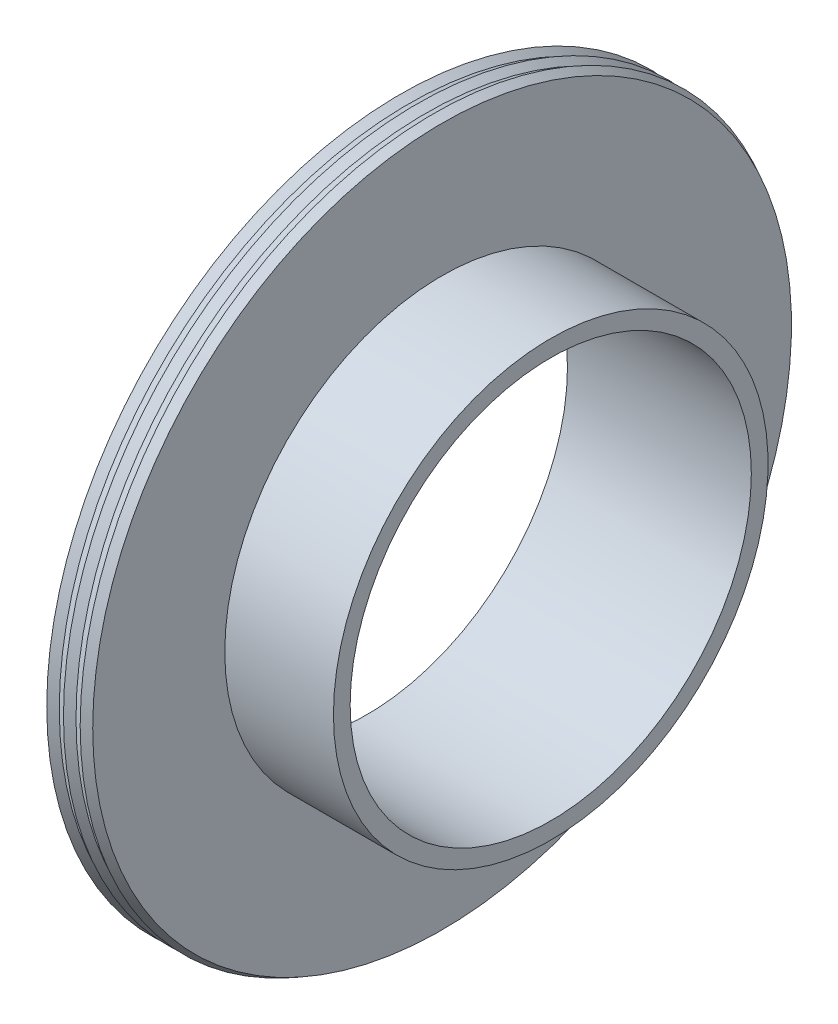
ISO-10303-21;
HEADER;
FILE_DESCRIPTION(('STEP AP214'),'2;1');
FILE_NAME('part.step','',(''),(''),'','','');
FILE_SCHEMA(('AUTOMOTIVE_DESIGN { 1 0 10303 214 1 1 1 1 }'));
ENDSEC;
DATA;
#1=APPLICATION_CONTEXT('core data for automotive mechanical design processes');
#2=APPLICATION_PROTOCOL_DEFINITION('international standard','automotive_design',2000,#1);
#3=PRODUCT_CONTEXT('',#1,'mechanical');
#4=PRODUCT('Part','Part','',(#3));
#5=PRODUCT_RELATED_PRODUCT_CATEGORY('part','',(#4));
#6=PRODUCT_DEFINITION_FORMATION('','',#4);
#7=PRODUCT_DEFINITION_CONTEXT('part definition',#1,'design');
#8=PRODUCT_DEFINITION('design','',#6,#7);
#9=PRODUCT_DEFINITION_SHAPE('','',#8);
#10=(LENGTH_UNIT() NAMED_UNIT(*) SI_UNIT(.MILLI.,.METRE.));
#11=(NAMED_UNIT(*) PLANE_ANGLE_UNIT() SI_UNIT($,.RADIAN.));
#12=(NAMED_UNIT(*) SI_UNIT($,.STERADIAN.) SOLID_ANGLE_UNIT());
#13=UNCERTAINTY_MEASURE_WITH_UNIT(LENGTH_MEASURE(1.E-05),#10,'distance_accuracy_value','');
#14=(GEOMETRIC_REPRESENTATION_CONTEXT(3) GLOBAL_UNCERTAINTY_ASSIGNED_CONTEXT((#13)) GLOBAL_UNIT_ASSIGNED_CONTEXT((#10,
#11,#12)) REPRESENTATION_CONTEXT('',''));
#15=CARTESIAN_POINT('',(0.,0.,0.));
#16=DIRECTION('',(0.,0.,1.));
#17=DIRECTION('',(1.,0.,0.));
#18=AXIS2_PLACEMENT_3D('',#15,#16,#17);
#19=CARTESIAN_POINT('',(6.00000000000001,0.,0.));
#20=DIRECTION('',(-1.,0.,0.));
#21=DIRECTION('',(0.,0.,1.));
#22=AXIS2_PLACEMENT_3D('',#19,#20,#21);
#23=CONICAL_SURFACE('',#22,42.3,0.463647609000817);
#24=CARTESIAN_POINT('',(7.,0.,0.));
#25=DIRECTION('',(-1.,0.,0.));
#26=DIRECTION('',(0.,0.,1.));
#27=AXIS2_PLACEMENT_3D('',#24,#25,#26);
#28=CIRCLE('',#27,41.8);
#29=CARTESIAN_POINT('',(7.,0.,41.8));
#30=VERTEX_POINT('',#29);
#31=EDGE_CURVE('E51',#30,#30,#28,.T.);
#32=ORIENTED_EDGE('',*,*,#31,.T.);
#33=EDGE_LOOP('',(#32));
#34=FACE_BOUND('',#33,.T.);
#35=CARTESIAN_POINT('',(6.00000000000001,0.,0.));
#36=DIRECTION('',(-1.,0.,0.));
#37=DIRECTION('',(0.,0.,1.));
#38=AXIS2_PLACEMENT_3D('',#35,#36,#37);
#39=CIRCLE('',#38,42.3);
#40=CARTESIAN_POINT('',(6.00000000000001,0.,42.3));
#41=VERTEX_POINT('',#40);
#42=EDGE_CURVE('E57',#41,#41,#39,.T.);
#43=ORIENTED_EDGE('',*,*,#42,.F.);
#44=EDGE_LOOP('',(#43));
#45=FACE_BOUND('',#44,.T.);
#46=ADVANCED_FACE('F43',(#34,#45),#23,.T.);
#47=CARTESIAN_POINT('',(7.,0.,0.));
#48=DIRECTION('',(1.,0.,0.));
#49=DIRECTION('',(0.,0.,-1.));
#50=AXIS2_PLACEMENT_3D('',#47,#48,#49);
#51=CONICAL_SURFACE('',#50,41.8,0.463647609000812);
#52=CARTESIAN_POINT('',(7.99999999999999,0.,0.));
#53=DIRECTION('',(-1.,0.,0.));
#54=DIRECTION('',(0.,0.,1.));
#55=AXIS2_PLACEMENT_3D('',#52,#53,#54);
#56=CIRCLE('',#55,42.3);
#57=CARTESIAN_POINT('',(7.99999999999999,0.,42.3));
#58=VERTEX_POINT('',#57);
#59=EDGE_CURVE('E10',#58,#58,#56,.T.);
#60=ORIENTED_EDGE('',*,*,#59,.T.);
#61=EDGE_LOOP('',(#60));
#62=FACE_BOUND('',#61,.T.);
#63=ORIENTED_EDGE('',*,*,#31,.F.);
#64=EDGE_LOOP('',(#63));
#65=FACE_BOUND('',#64,.T.);
#66=ADVANCED_FACE('F96',(#62,#65),#51,.T.);
#67=CARTESIAN_POINT('',(7.99999999999999,0.,0.));
#68=DIRECTION('',(-1.,0.,0.));
#69=DIRECTION('',(0.,0.,1.));
#70=AXIS2_PLACEMENT_3D('',#67,#68,#69);
#71=CONICAL_SURFACE('',#70,42.3,0.4636476090008);
#72=CARTESIAN_POINT('',(9.,0.,0.));
#73=DIRECTION('',(-1.,0.,0.));
#74=DIRECTION('',(0.,0.,1.));
#75=AXIS2_PLACEMENT_3D('',#72,#73,#74);
#76=CIRCLE('',#75,41.8);
#77=CARTESIAN_POINT('',(9.,0.,41.8));
#78=VERTEX_POINT('',#77);
#79=EDGE_CURVE('E66',#78,#78,#76,.T.);
#80=ORIENTED_EDGE('',*,*,#79,.T.);
#81=EDGE_LOOP('',(#80));
#82=FACE_BOUND('',#81,.T.);
#83=ORIENTED_EDGE('',*,*,#59,.F.);
#84=EDGE_LOOP('',(#83));
#85=FACE_BOUND('',#84,.T.);
#86=ADVANCED_FACE('F105',(#82,#85),#71,.T.);
#87=CARTESIAN_POINT('',(9.,0.,0.));
#88=DIRECTION('',(1.,0.,0.));
#89=DIRECTION('',(0.,0.,-1.));
#90=AXIS2_PLACEMENT_3D('',#87,#88,#89);
#91=PLANE('',#90);
#92=CARTESIAN_POINT('',(9.,0.,0.));
#93=DIRECTION('',(-1.,0.,0.));
#94=DIRECTION('',(0.,0.,1.));
#95=AXIS2_PLACEMENT_3D('',#92,#93,#94);
#96=CIRCLE('',#95,26.);
#97=CARTESIAN_POINT('',(9.,0.,26.));
#98=VERTEX_POINT('',#97);
#99=EDGE_CURVE('E74',#98,#98,#96,.T.);
#100=ORIENTED_EDGE('',*,*,#99,.T.);
#101=EDGE_LOOP('',(#100));
#102=FACE_BOUND('',#101,.T.);
#103=ORIENTED_EDGE('',*,*,#79,.F.);
#104=EDGE_LOOP('',(#103));
#105=FACE_BOUND('',#104,.T.);
#106=ADVANCED_FACE('F108',(#102,#105),#91,.T.);
#107=CARTESIAN_POINT('',(5.,0.,0.));
#108=DIRECTION('',(1.,0.,0.));
#109=DIRECTION('',(0.,0.,-1.));
#110=AXIS2_PLACEMENT_3D('',#107,#108,#109);
#111=CONICAL_SURFACE('',#110,41.8,0.463647609000806);
#112=ORIENTED_EDGE('',*,*,#42,.T.);
#113=EDGE_LOOP('',(#112));
#114=FACE_BOUND('',#113,.T.);
#115=CARTESIAN_POINT('',(5.,0.,0.));
#116=DIRECTION('',(-1.,0.,0.));
#117=DIRECTION('',(0.,0.,1.));
#118=AXIS2_PLACEMENT_3D('',#115,#116,#117);
#119=CIRCLE('',#118,41.8);
#120=CARTESIAN_POINT('',(5.,0.,41.8));
#121=VERTEX_POINT('',#120);
#122=EDGE_CURVE('E87',#121,#121,#119,.T.);
#123=ORIENTED_EDGE('',*,*,#122,.F.);
#124=EDGE_LOOP('',(#123));
#125=FACE_BOUND('',#124,.T.);
#126=ADVANCED_FACE('F95',(#114,#125),#111,.T.);
#127=CARTESIAN_POINT('',(4.,0.,0.));
#128=DIRECTION('',(-1.,0.,0.));
#129=DIRECTION('',(0.,0.,1.));
#130=AXIS2_PLACEMENT_3D('',#127,#128,#129);
#131=CONICAL_SURFACE('',#130,42.3,0.463647609000806);
#132=ORIENTED_EDGE('',*,*,#122,.T.);
#133=EDGE_LOOP('',(#132));
#134=FACE_BOUND('',#133,.T.);
#135=CARTESIAN_POINT('',(4.,0.,0.));
#136=DIRECTION('',(-1.,0.,0.));
#137=DIRECTION('',(0.,0.,1.));
#138=AXIS2_PLACEMENT_3D('',#135,#136,#137);
#139=CIRCLE('',#138,42.3);
#140=CARTESIAN_POINT('',(4.,0.,42.3));
#141=VERTEX_POINT('',#140);
#142=EDGE_CURVE('E84',#141,#141,#139,.T.);
#143=ORIENTED_EDGE('',*,*,#142,.F.);
#144=EDGE_LOOP('',(#143));
#145=FACE_BOUND('',#144,.T.);
#146=ADVANCED_FACE('F121',(#134,#145),#131,.T.);
#147=CARTESIAN_POINT('',(4.,0.,0.));
#148=DIRECTION('',(-1.,0.,0.));
#149=DIRECTION('',(0.,0.,1.));
#150=AXIS2_PLACEMENT_3D('',#147,#148,#149);
#151=PLANE('',#150);
#152=ORIENTED_EDGE('',*,*,#142,.T.);
#153=EDGE_LOOP('',(#152));
#154=FACE_BOUND('',#153,.T.);
#155=CARTESIAN_POINT('',(4.,0.,0.));
#156=DIRECTION('',(-1.,0.,0.));
#157=DIRECTION('',(0.,0.,1.));
#158=AXIS2_PLACEMENT_3D('',#155,#156,#157);
#159=CIRCLE('',#158,26.);
#160=CARTESIAN_POINT('',(4.,0.,26.));
#161=VERTEX_POINT('',#160);
#162=EDGE_CURVE('E78',#161,#161,#159,.T.);
#163=ORIENTED_EDGE('',*,*,#162,.F.);
#164=EDGE_LOOP('',(#163));
#165=FACE_BOUND('',#164,.T.);
#166=ADVANCED_FACE('F120',(#154,#165),#151,.T.);
#167=CARTESIAN_POINT('',(-59.6592581066923,0.,0.));
#168=DIRECTION('',(-1.,0.,0.));
#169=DIRECTION('',(0.,0.,1.));
#170=AXIS2_PLACEMENT_3D('',#167,#168,#169);
#171=CYLINDRICAL_SURFACE('',#170,24.);
#172=CARTESIAN_POINT('',(22.,0.,0.));
#173=DIRECTION('',(-1.,0.,0.));
#174=DIRECTION('',(0.,0.,1.));
#175=AXIS2_PLACEMENT_3D('',#172,#173,#174);
#176=CIRCLE('',#175,24.);
#177=CARTESIAN_POINT('',(22.,0.,24.));
#178=VERTEX_POINT('',#177);
#179=EDGE_CURVE('E65',#178,#178,#176,.T.);
#180=ORIENTED_EDGE('',*,*,#179,.F.);
#181=EDGE_LOOP('',(#180));
#182=FACE_BOUND('',#181,.T.);
#183=CARTESIAN_POINT('',(0.,0.,0.));
#184=DIRECTION('',(-1.,0.,0.));
#185=DIRECTION('',(0.,0.,1.));
#186=AXIS2_PLACEMENT_3D('',#183,#184,#185);
#187=CIRCLE('',#186,24.);
#188=CARTESIAN_POINT('',(0.,0.,24.));
#189=VERTEX_POINT('',#188);
#190=EDGE_CURVE('E50',#189,#189,#187,.T.);
#191=ORIENTED_EDGE('',*,*,#190,.T.);
#192=EDGE_LOOP('',(#191));
#193=FACE_BOUND('',#192,.T.);
#194=ADVANCED_FACE('F117',(#182,#193),#171,.F.);
#195=CARTESIAN_POINT('',(22.,24.,0.));
#196=DIRECTION('',(-1.,0.,0.));
#197=DIRECTION('',(0.,0.,1.));
#198=AXIS2_PLACEMENT_3D('',#195,#196,#197);
#199=PLANE('',#198);
#200=CARTESIAN_POINT('',(22.,0.,0.));
#201=DIRECTION('',(-1.,0.,0.));
#202=DIRECTION('',(0.,0.,1.));
#203=AXIS2_PLACEMENT_3D('',#200,#201,#202);
#204=CIRCLE('',#203,26.);
#205=CARTESIAN_POINT('',(22.,0.,26.));
#206=VERTEX_POINT('',#205);
#207=EDGE_CURVE('E64',#206,#206,#204,.T.);
#208=ORIENTED_EDGE('',*,*,#207,.F.);
#209=EDGE_LOOP('',(#208));
#210=FACE_BOUND('',#209,.T.);
#211=ORIENTED_EDGE('',*,*,#179,.T.);
#212=EDGE_LOOP('',(#211));
#213=FACE_BOUND('',#212,.T.);
#214=ADVANCED_FACE('F114',(#210,#213),#199,.F.);
#215=CARTESIAN_POINT('',(-59.6592581066923,0.,0.));
#216=DIRECTION('',(-1.,0.,0.));
#217=DIRECTION('',(0.,0.,1.));
#218=AXIS2_PLACEMENT_3D('',#215,#216,#217);
#219=CYLINDRICAL_SURFACE('',#218,26.);
#220=ORIENTED_EDGE('',*,*,#99,.F.);
#221=EDGE_LOOP('',(#220));
#222=FACE_BOUND('',#221,.T.);
#223=ORIENTED_EDGE('',*,*,#207,.T.);
#224=EDGE_LOOP('',(#223));
#225=FACE_BOUND('',#224,.T.);
#226=ADVANCED_FACE('F109',(#222,#225),#219,.T.);
#227=CARTESIAN_POINT('',(0.,26.,0.));
#228=DIRECTION('',(1.,0.,0.));
#229=DIRECTION('',(0.,0.,-1.));
#230=AXIS2_PLACEMENT_3D('',#227,#228,#229);
#231=PLANE('',#230);
#232=ORIENTED_EDGE('',*,*,#190,.F.);
#233=EDGE_LOOP('',(#232));
#234=FACE_BOUND('',#233,.T.);
#235=CARTESIAN_POINT('',(0.,0.,0.));
#236=DIRECTION('',(-1.,0.,0.));
#237=DIRECTION('',(0.,0.,1.));
#238=AXIS2_PLACEMENT_3D('',#235,#236,#237);
#239=CIRCLE('',#238,26.);
#240=CARTESIAN_POINT('',(0.,0.,26.));
#241=VERTEX_POINT('',#240);
#242=EDGE_CURVE('E58',#241,#241,#239,.T.);
#243=ORIENTED_EDGE('',*,*,#242,.T.);
#244=EDGE_LOOP('',(#243));
#245=FACE_BOUND('',#244,.T.);
#246=ADVANCED_FACE('F44',(#234,#245),#231,.F.);
#247=ORIENTED_EDGE('',*,*,#162,.T.);
#248=EDGE_LOOP('',(#247));
#249=FACE_BOUND('',#248,.T.);
#250=ORIENTED_EDGE('',*,*,#242,.F.);
#251=EDGE_LOOP('',(#250));
#252=FACE_BOUND('',#251,.T.);
#253=ADVANCED_FACE('F113',(#249,#252),#219,.T.);
#254=CLOSED_SHELL('',(#46,#66,#86,#106,#126,#146,#166,#194,#214,#226,#246,#253));
#255=MANIFOLD_SOLID_BREP('B2',#254);
#256=ADVANCED_BREP_SHAPE_REPRESENTATION('',(#18,#255),#14);
#257=SHAPE_DEFINITION_REPRESENTATION(#9,#256);
ENDSEC;
END-ISO-10303-21;
